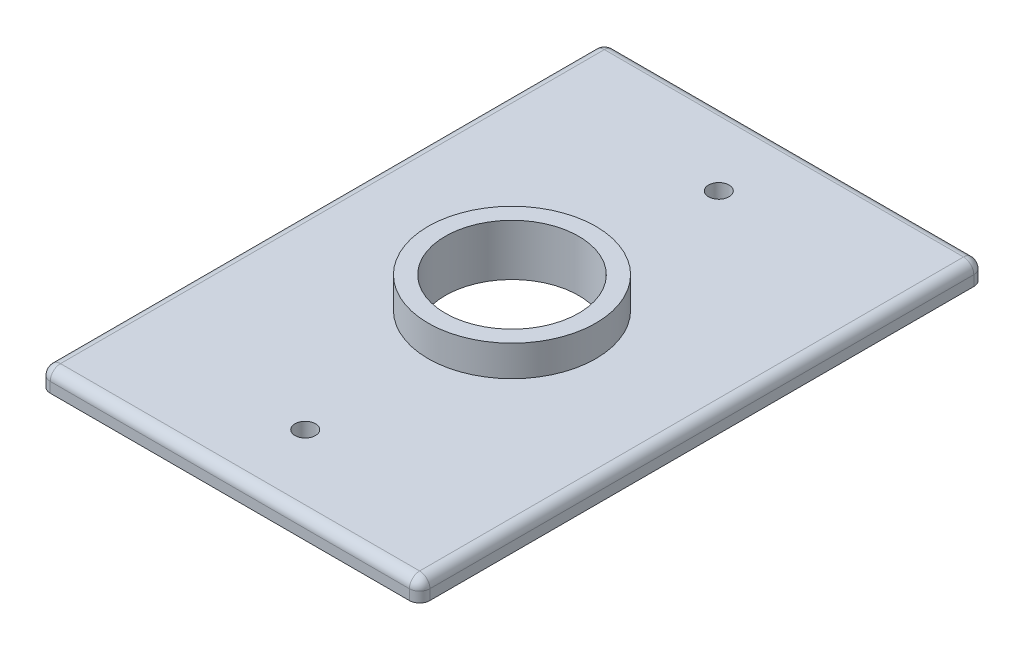
ISO-10303-21;
HEADER;
FILE_DESCRIPTION(('STEP AP214'),'2;1');
FILE_NAME('part.step','',(''),(''),'','','');
FILE_SCHEMA(('AUTOMOTIVE_DESIGN { 1 0 10303 214 1 1 1 1 }'));
ENDSEC;
DATA;
#1=APPLICATION_CONTEXT('core data for automotive mechanical design processes');
#2=APPLICATION_PROTOCOL_DEFINITION('international standard','automotive_design',2000,#1);
#3=PRODUCT_CONTEXT('',#1,'mechanical');
#4=PRODUCT('Part','Part','',(#3));
#5=PRODUCT_RELATED_PRODUCT_CATEGORY('part','',(#4));
#6=PRODUCT_DEFINITION_FORMATION('','',#4);
#7=PRODUCT_DEFINITION_CONTEXT('part definition',#1,'design');
#8=PRODUCT_DEFINITION('design','',#6,#7);
#9=PRODUCT_DEFINITION_SHAPE('','',#8);
#10=(LENGTH_UNIT() NAMED_UNIT(*) SI_UNIT(.MILLI.,.METRE.));
#11=(NAMED_UNIT(*) PLANE_ANGLE_UNIT() SI_UNIT($,.RADIAN.));
#12=(NAMED_UNIT(*) SI_UNIT($,.STERADIAN.) SOLID_ANGLE_UNIT());
#13=UNCERTAINTY_MEASURE_WITH_UNIT(LENGTH_MEASURE(1.E-05),#10,'distance_accuracy_value','');
#14=(GEOMETRIC_REPRESENTATION_CONTEXT(3) GLOBAL_UNCERTAINTY_ASSIGNED_CONTEXT((#13)) GLOBAL_UNIT_ASSIGNED_CONTEXT((#10,
#11,#12)) REPRESENTATION_CONTEXT('',''));
#15=CARTESIAN_POINT('',(0.,0.,0.));
#16=DIRECTION('',(0.,0.,1.));
#17=DIRECTION('',(1.,0.,0.));
#18=AXIS2_PLACEMENT_3D('',#15,#16,#17);
#19=CARTESIAN_POINT('',(0.,4.,0.));
#20=DIRECTION('',(0.,1.,0.));
#21=DIRECTION('',(0.,0.,1.));
#22=AXIS2_PLACEMENT_3D('',#19,#20,#21);
#23=PLANE('',#22);
#24=CARTESIAN_POINT('',(27.7075120139594,4.,3.72893254695976));
#25=DIRECTION('',(0.,1.,0.));
#26=DIRECTION('',(0.,0.,1.));
#27=AXIS2_PLACEMENT_3D('',#24,#25,#26);
#28=CIRCLE('',#27,2.);
#29=CARTESIAN_POINT('',(27.7075120139594,4.,5.72893254695976));
#30=VERTEX_POINT('',#29);
#31=EDGE_CURVE('E217',#30,#30,#28,.F.);
#32=ORIENTED_EDGE('',*,*,#31,.T.);
#33=EDGE_LOOP('',(#32));
#34=FACE_BOUND('',#33,.T.);
#35=DIRECTION('',(-1.,0.,0.));
#36=VECTOR('',#35,1.);
#37=CARTESIAN_POINT('',(-9.29248798604063,4.,-8.97106745304024));
#38=LINE('',#37,#36);
#39=CARTESIAN_POINT('',(62.7075120139594,4.,-8.97106745304024));
#40=VERTEX_POINT('',#39);
#41=CARTESIAN_POINT('',(-7.29248798604063,4.,-8.97106745304024));
#42=VERTEX_POINT('',#41);
#43=EDGE_CURVE('E175',#40,#42,#38,.T.);
#44=ORIENTED_EDGE('',*,*,#43,.T.);
#45=DIRECTION('',(0.,0.,1.));
#46=VECTOR('',#45,1.);
#47=CARTESIAN_POINT('',(-7.29248798604061,4.,97.0289325469598));
#48=LINE('',#47,#46);
#49=CARTESIAN_POINT('',(-7.29248798604061,4.,97.0289325469598));
#50=VERTEX_POINT('',#49);
#51=EDGE_CURVE('E11',#42,#50,#48,.T.);
#52=ORIENTED_EDGE('',*,*,#51,.T.);
#53=DIRECTION('',(1.,0.,0.));
#54=VECTOR('',#53,1.);
#55=CARTESIAN_POINT('',(64.7075120139594,4.,97.0289325469598));
#56=LINE('',#55,#54);
#57=CARTESIAN_POINT('',(62.7075120139594,4.,97.0289325469598));
#58=VERTEX_POINT('',#57);
#59=EDGE_CURVE('E142',#50,#58,#56,.T.);
#60=ORIENTED_EDGE('',*,*,#59,.T.);
#61=DIRECTION('',(0.,0.,-1.));
#62=VECTOR('',#61,1.);
#63=CARTESIAN_POINT('',(62.7075120139594,4.,-10.9710674530402));
#64=LINE('',#63,#62);
#65=EDGE_CURVE('E156',#58,#40,#64,.T.);
#66=ORIENTED_EDGE('',*,*,#65,.T.);
#67=EDGE_LOOP('',(#44,#52,#60,#66));
#68=FACE_BOUND('',#67,.T.);
#69=CARTESIAN_POINT('',(27.7075120139594,4.,84.3289325469597));
#70=DIRECTION('',(0.,1.,0.));
#71=DIRECTION('',(0.,0.,1.));
#72=AXIS2_PLACEMENT_3D('',#69,#70,#71);
#73=CIRCLE('',#72,2.);
#74=CARTESIAN_POINT('',(27.7075120139594,4.,86.3289325469597));
#75=VERTEX_POINT('',#74);
#76=EDGE_CURVE('E214',#75,#75,#73,.F.);
#77=ORIENTED_EDGE('',*,*,#76,.T.);
#78=EDGE_LOOP('',(#77));
#79=FACE_BOUND('',#78,.T.);
#80=CARTESIAN_POINT('',(27.7075120139594,4.,44.0289325469597));
#81=DIRECTION('',(0.,1.,0.));
#82=DIRECTION('',(0.,0.,1.));
#83=AXIS2_PLACEMENT_3D('',#80,#81,#82);
#84=CIRCLE('',#83,16.3436814833848);
#85=CARTESIAN_POINT('',(27.7075120139594,4.,60.3726140303445));
#86=VERTEX_POINT('',#85);
#87=EDGE_CURVE('E227',#86,#86,#84,.F.);
#88=ORIENTED_EDGE('',*,*,#87,.T.);
#89=EDGE_LOOP('',(#88));
#90=FACE_BOUND('',#89,.T.);
#91=ADVANCED_FACE('F35',(#34,#68,#79,#90),#23,.T.);
#92=CARTESIAN_POINT('',(0.,0.,0.));
#93=DIRECTION('',(0.,1.,0.));
#94=DIRECTION('',(0.,0.,1.));
#95=AXIS2_PLACEMENT_3D('',#92,#93,#94);
#96=PLANE('',#95);
#97=CARTESIAN_POINT('',(27.7075120139594,0.,44.0289325469597));
#98=DIRECTION('',(0.,1.,0.));
#99=DIRECTION('',(0.,0.,1.));
#100=AXIS2_PLACEMENT_3D('',#97,#98,#99);
#101=CIRCLE('',#100,13.);
#102=CARTESIAN_POINT('',(27.7075120139594,0.,57.0289325469597));
#103=VERTEX_POINT('',#102);
#104=EDGE_CURVE('E205',#103,#103,#101,.T.);
#105=ORIENTED_EDGE('',*,*,#104,.T.);
#106=EDGE_LOOP('',(#105));
#107=FACE_BOUND('',#106,.T.);
#108=CARTESIAN_POINT('',(27.7075120139594,0.,3.72893254695976));
#109=DIRECTION('',(0.,1.,0.));
#110=DIRECTION('',(0.,0.,1.));
#111=AXIS2_PLACEMENT_3D('',#108,#109,#110);
#112=CIRCLE('',#111,2.);
#113=CARTESIAN_POINT('',(27.7075120139594,0.,5.72893254695976));
#114=VERTEX_POINT('',#113);
#115=EDGE_CURVE('E39',#114,#114,#112,.F.);
#116=ORIENTED_EDGE('',*,*,#115,.F.);
#117=EDGE_LOOP('',(#116));
#118=FACE_BOUND('',#117,.T.);
#119=DIRECTION('',(0.,0.,1.));
#120=VECTOR('',#119,1.);
#121=CARTESIAN_POINT('',(-9.29248798604063,0.,-10.9710674530402));
#122=LINE('',#121,#120);
#123=CARTESIAN_POINT('',(-9.29248798604063,0.,-8.97106745304024));
#124=VERTEX_POINT('',#123);
#125=CARTESIAN_POINT('',(-9.29248798604061,0.,97.0289325469598));
#126=VERTEX_POINT('',#125);
#127=EDGE_CURVE('E144',#124,#126,#122,.T.);
#128=ORIENTED_EDGE('',*,*,#127,.F.);
#129=CARTESIAN_POINT('',(-7.29248798604063,0.,-8.97106745304024));
#130=DIRECTION('',(0.,1.,0.));
#131=DIRECTION('',(0.,0.,1.));
#132=AXIS2_PLACEMENT_3D('',#129,#130,#131);
#133=CIRCLE('',#132,2.);
#134=CARTESIAN_POINT('',(-7.29248798604063,0.,-10.9710674530402));
#135=VERTEX_POINT('',#134);
#136=EDGE_CURVE('E192',#124,#135,#133,.F.);
#137=ORIENTED_EDGE('',*,*,#136,.T.);
#138=DIRECTION('',(-1.,0.,0.));
#139=VECTOR('',#138,1.);
#140=CARTESIAN_POINT('',(-9.29248798604063,0.,-10.9710674530402));
#141=LINE('',#140,#139);
#142=CARTESIAN_POINT('',(62.7075120139594,0.,-10.9710674530402));
#143=VERTEX_POINT('',#142);
#144=EDGE_CURVE('E138',#143,#135,#141,.T.);
#145=ORIENTED_EDGE('',*,*,#144,.F.);
#146=CARTESIAN_POINT('',(62.7075120139594,0.,-8.97106745304024));
#147=DIRECTION('',(0.,1.,0.));
#148=DIRECTION('',(0.,0.,1.));
#149=AXIS2_PLACEMENT_3D('',#146,#147,#148);
#150=CIRCLE('',#149,2.);
#151=CARTESIAN_POINT('',(64.7075120139594,0.,-8.97106745304024));
#152=VERTEX_POINT('',#151);
#153=EDGE_CURVE('E137',#143,#152,#150,.F.);
#154=ORIENTED_EDGE('',*,*,#153,.T.);
#155=DIRECTION('',(0.,0.,-1.));
#156=VECTOR('',#155,1.);
#157=CARTESIAN_POINT('',(64.7075120139594,0.,-10.9710674530402));
#158=LINE('',#157,#156);
#159=CARTESIAN_POINT('',(64.7075120139594,0.,97.0289325469598));
#160=VERTEX_POINT('',#159);
#161=EDGE_CURVE('E127',#160,#152,#158,.T.);
#162=ORIENTED_EDGE('',*,*,#161,.F.);
#163=CARTESIAN_POINT('',(62.7075120139594,0.,97.0289325469598));
#164=DIRECTION('',(0.,1.,0.));
#165=DIRECTION('',(0.,0.,1.));
#166=AXIS2_PLACEMENT_3D('',#163,#164,#165);
#167=CIRCLE('',#166,2.);
#168=CARTESIAN_POINT('',(62.7075120139594,0.,99.0289325469598));
#169=VERTEX_POINT('',#168);
#170=EDGE_CURVE('E114',#160,#169,#167,.F.);
#171=ORIENTED_EDGE('',*,*,#170,.T.);
#172=DIRECTION('',(1.,0.,0.));
#173=VECTOR('',#172,1.);
#174=CARTESIAN_POINT('',(-9.29248798604061,0.,99.0289325469598));
#175=LINE('',#174,#173);
#176=CARTESIAN_POINT('',(-7.29248798604061,0.,99.0289325469598));
#177=VERTEX_POINT('',#176);
#178=EDGE_CURVE('E139',#177,#169,#175,.T.);
#179=ORIENTED_EDGE('',*,*,#178,.F.);
#180=CARTESIAN_POINT('',(-7.29248798604061,0.,97.0289325469598));
#181=DIRECTION('',(0.,1.,0.));
#182=DIRECTION('',(0.,0.,1.));
#183=AXIS2_PLACEMENT_3D('',#180,#181,#182);
#184=CIRCLE('',#183,2.);
#185=EDGE_CURVE('E190',#177,#126,#184,.F.);
#186=ORIENTED_EDGE('',*,*,#185,.T.);
#187=EDGE_LOOP('',(#128,#137,#145,#154,#162,#171,#179,#186));
#188=FACE_BOUND('',#187,.T.);
#189=CARTESIAN_POINT('',(27.7075120139594,0.,84.3289325469597));
#190=DIRECTION('',(0.,1.,0.));
#191=DIRECTION('',(0.,0.,1.));
#192=AXIS2_PLACEMENT_3D('',#189,#190,#191);
#193=CIRCLE('',#192,2.);
#194=CARTESIAN_POINT('',(27.7075120139594,0.,86.3289325469597));
#195=VERTEX_POINT('',#194);
#196=EDGE_CURVE('E215',#195,#195,#193,.F.);
#197=ORIENTED_EDGE('',*,*,#196,.F.);
#198=EDGE_LOOP('',(#197));
#199=FACE_BOUND('',#198,.T.);
#200=ADVANCED_FACE('F134',(#107,#118,#188,#199),#96,.F.);
#201=CARTESIAN_POINT('',(-9.29248798604063,4.,-10.9710674530402));
#202=DIRECTION('',(1.,0.,0.));
#203=DIRECTION('',(0.,0.,-1.));
#204=AXIS2_PLACEMENT_3D('',#201,#202,#203);
#205=PLANE('',#204);
#206=DIRECTION('',(0.,0.,1.));
#207=VECTOR('',#206,1.);
#208=CARTESIAN_POINT('',(-9.29248798604063,2.,-8.97106745304024));
#209=LINE('',#208,#207);
#210=CARTESIAN_POINT('',(-9.29248798604061,2.,97.0289325469598));
#211=VERTEX_POINT('',#210);
#212=CARTESIAN_POINT('',(-9.29248798604063,2.,-8.97106745304024));
#213=VERTEX_POINT('',#212);
#214=EDGE_CURVE('E177',#211,#213,#209,.F.);
#215=ORIENTED_EDGE('',*,*,#214,.T.);
#216=DIRECTION('',(0.,-1.,0.));
#217=VECTOR('',#216,1.);
#218=CARTESIAN_POINT('',(-9.29248798604063,4.,-8.97106745304024));
#219=LINE('',#218,#217);
#220=EDGE_CURVE('E187',#213,#124,#219,.T.);
#221=ORIENTED_EDGE('',*,*,#220,.T.);
#222=ORIENTED_EDGE('',*,*,#127,.T.);
#223=DIRECTION('',(0.,-1.,0.));
#224=VECTOR('',#223,1.);
#225=CARTESIAN_POINT('',(-9.29248798604061,4.,97.0289325469598));
#226=LINE('',#225,#224);
#227=EDGE_CURVE('E185',#126,#211,#226,.F.);
#228=ORIENTED_EDGE('',*,*,#227,.T.);
#229=EDGE_LOOP('',(#215,#221,#222,#228));
#230=FACE_BOUND('',#229,.T.);
#231=ADVANCED_FACE('F233',(#230),#205,.F.);
#232=CARTESIAN_POINT('',(-9.29248798604061,4.,99.0289325469598));
#233=DIRECTION('',(0.,0.,-1.));
#234=DIRECTION('',(-1.,0.,0.));
#235=AXIS2_PLACEMENT_3D('',#232,#233,#234);
#236=PLANE('',#235);
#237=DIRECTION('',(1.,0.,0.));
#238=VECTOR('',#237,1.);
#239=CARTESIAN_POINT('',(-9.29248798604061,2.,99.0289325469598));
#240=LINE('',#239,#238);
#241=CARTESIAN_POINT('',(62.7075120139594,2.,99.0289325469598));
#242=VERTEX_POINT('',#241);
#243=CARTESIAN_POINT('',(-7.29248798604061,2.,99.0289325469598));
#244=VERTEX_POINT('',#243);
#245=EDGE_CURVE('E149',#242,#244,#240,.F.);
#246=ORIENTED_EDGE('',*,*,#245,.T.);
#247=DIRECTION('',(0.,-1.,0.));
#248=VECTOR('',#247,1.);
#249=CARTESIAN_POINT('',(-7.29248798604061,4.,99.0289325469598));
#250=LINE('',#249,#248);
#251=EDGE_CURVE('E198',#244,#177,#250,.T.);
#252=ORIENTED_EDGE('',*,*,#251,.T.);
#253=ORIENTED_EDGE('',*,*,#178,.T.);
#254=DIRECTION('',(0.,-1.,0.));
#255=VECTOR('',#254,1.);
#256=CARTESIAN_POINT('',(62.7075120139594,4.,99.0289325469598));
#257=LINE('',#256,#255);
#258=EDGE_CURVE('E119',#169,#242,#257,.F.);
#259=ORIENTED_EDGE('',*,*,#258,.T.);
#260=EDGE_LOOP('',(#246,#252,#253,#259));
#261=FACE_BOUND('',#260,.T.);
#262=ADVANCED_FACE('F277',(#261),#236,.F.);
#263=CARTESIAN_POINT('',(64.7075120139594,4.,-10.9710674530402));
#264=DIRECTION('',(-1.,0.,0.));
#265=DIRECTION('',(0.,0.,1.));
#266=AXIS2_PLACEMENT_3D('',#263,#264,#265);
#267=PLANE('',#266);
#268=ORIENTED_EDGE('',*,*,#161,.T.);
#269=DIRECTION('',(0.,-1.,0.));
#270=VECTOR('',#269,1.);
#271=CARTESIAN_POINT('',(64.7075120139594,4.,-8.97106745304024));
#272=LINE('',#271,#270);
#273=CARTESIAN_POINT('',(64.7075120139594,2.,-8.97106745304024));
#274=VERTEX_POINT('',#273);
#275=EDGE_CURVE('E171',#152,#274,#272,.F.);
#276=ORIENTED_EDGE('',*,*,#275,.T.);
#277=DIRECTION('',(0.,0.,-1.));
#278=VECTOR('',#277,1.);
#279=CARTESIAN_POINT('',(64.7075120139594,2.,97.0289325469598));
#280=LINE('',#279,#278);
#281=CARTESIAN_POINT('',(64.7075120139594,2.,97.0289325469598));
#282=VERTEX_POINT('',#281);
#283=EDGE_CURVE('E130',#274,#282,#280,.F.);
#284=ORIENTED_EDGE('',*,*,#283,.T.);
#285=DIRECTION('',(0.,-1.,0.));
#286=VECTOR('',#285,1.);
#287=CARTESIAN_POINT('',(64.7075120139594,4.,97.0289325469598));
#288=LINE('',#287,#286);
#289=EDGE_CURVE('E118',#282,#160,#288,.T.);
#290=ORIENTED_EDGE('',*,*,#289,.T.);
#291=EDGE_LOOP('',(#268,#276,#284,#290));
#292=FACE_BOUND('',#291,.T.);
#293=ADVANCED_FACE('F126',(#292),#267,.F.);
#294=CARTESIAN_POINT('',(-9.29248798604063,4.,-10.9710674530402));
#295=DIRECTION('',(0.,0.,1.));
#296=DIRECTION('',(1.,0.,0.));
#297=AXIS2_PLACEMENT_3D('',#294,#295,#296);
#298=PLANE('',#297);
#299=ORIENTED_EDGE('',*,*,#144,.T.);
#300=DIRECTION('',(0.,-1.,0.));
#301=VECTOR('',#300,1.);
#302=CARTESIAN_POINT('',(-7.29248798604063,4.,-10.9710674530402));
#303=LINE('',#302,#301);
#304=CARTESIAN_POINT('',(-7.29248798604062,2.,-10.9710674530402));
#305=VERTEX_POINT('',#304);
#306=EDGE_CURVE('E194',#135,#305,#303,.F.);
#307=ORIENTED_EDGE('',*,*,#306,.T.);
#308=DIRECTION('',(-1.,0.,0.));
#309=VECTOR('',#308,1.);
#310=CARTESIAN_POINT('',(62.7075120139594,2.,-10.9710674530402));
#311=LINE('',#310,#309);
#312=CARTESIAN_POINT('',(62.7075120139594,2.,-10.9710674530402));
#313=VERTEX_POINT('',#312);
#314=EDGE_CURVE('E159',#305,#313,#311,.F.);
#315=ORIENTED_EDGE('',*,*,#314,.T.);
#316=DIRECTION('',(0.,-1.,0.));
#317=VECTOR('',#316,1.);
#318=CARTESIAN_POINT('',(62.7075120139594,4.,-10.9710674530402));
#319=LINE('',#318,#317);
#320=EDGE_CURVE('E167',#313,#143,#319,.T.);
#321=ORIENTED_EDGE('',*,*,#320,.T.);
#322=EDGE_LOOP('',(#299,#307,#315,#321));
#323=FACE_BOUND('',#322,.T.);
#324=ADVANCED_FACE('F254',(#323),#298,.F.);
#325=CARTESIAN_POINT('',(0.,2.,97.0289325469598));
#326=DIRECTION('',(-1.,0.,0.));
#327=DIRECTION('',(0.,0.,1.));
#328=AXIS2_PLACEMENT_3D('',#325,#326,#327);
#329=CYLINDRICAL_SURFACE('',#328,2.);
#330=ORIENTED_EDGE('',*,*,#59,.F.);
#331=CARTESIAN_POINT('',(-7.29248798604061,2.,97.0289325469598));
#332=DIRECTION('',(-1.,0.,0.));
#333=DIRECTION('',(0.,0.,1.));
#334=AXIS2_PLACEMENT_3D('',#331,#332,#333);
#335=CIRCLE('',#334,2.);
#336=EDGE_CURVE('E44',#50,#244,#335,.F.);
#337=ORIENTED_EDGE('',*,*,#336,.T.);
#338=ORIENTED_EDGE('',*,*,#245,.F.);
#339=CARTESIAN_POINT('',(62.7075120139594,2.,97.0289325469598));
#340=DIRECTION('',(-1.,0.,0.));
#341=DIRECTION('',(0.,0.,1.));
#342=AXIS2_PLACEMENT_3D('',#339,#340,#341);
#343=CIRCLE('',#342,2.);
#344=EDGE_CURVE('E153',#242,#58,#343,.T.);
#345=ORIENTED_EDGE('',*,*,#344,.T.);
#346=EDGE_LOOP('',(#330,#337,#338,#345));
#347=FACE_BOUND('',#346,.T.);
#348=ADVANCED_FACE('F275',(#347),#329,.T.);
#349=CARTESIAN_POINT('',(62.7075120139594,2.,0.));
#350=DIRECTION('',(0.,0.,1.));
#351=DIRECTION('',(1.,0.,0.));
#352=AXIS2_PLACEMENT_3D('',#349,#350,#351);
#353=CYLINDRICAL_SURFACE('',#352,2.);
#354=ORIENTED_EDGE('',*,*,#283,.F.);
#355=CARTESIAN_POINT('',(62.7075120139594,2.,-8.97106745304024));
#356=DIRECTION('',(0.,0.,1.));
#357=DIRECTION('',(1.,0.,0.));
#358=AXIS2_PLACEMENT_3D('',#355,#356,#357);
#359=CIRCLE('',#358,2.);
#360=EDGE_CURVE('E173',#274,#40,#359,.T.);
#361=ORIENTED_EDGE('',*,*,#360,.T.);
#362=ORIENTED_EDGE('',*,*,#65,.F.);
#363=CARTESIAN_POINT('',(62.7075120139594,2.,97.0289325469598));
#364=DIRECTION('',(0.,0.,1.));
#365=DIRECTION('',(1.,0.,0.));
#366=AXIS2_PLACEMENT_3D('',#363,#364,#365);
#367=CIRCLE('',#366,2.);
#368=EDGE_CURVE('E162',#282,#58,#367,.T.);
#369=ORIENTED_EDGE('',*,*,#368,.F.);
#370=EDGE_LOOP('',(#354,#361,#362,#369));
#371=FACE_BOUND('',#370,.T.);
#372=ADVANCED_FACE('F263',(#371),#353,.T.);
#373=CARTESIAN_POINT('',(62.7075120139594,2.,97.0289325469598));
#374=DIRECTION('',(0.,0.,1.));
#375=DIRECTION('',(1.,0.,0.));
#376=AXIS2_PLACEMENT_3D('',#373,#374,#375);
#377=SPHERICAL_SURFACE('',#376,2.);
#378=ORIENTED_EDGE('',*,*,#368,.T.);
#379=ORIENTED_EDGE('',*,*,#344,.F.);
#380=CARTESIAN_POINT('',(62.7075120139594,2.,97.0289325469598));
#381=DIRECTION('',(0.,-1.,0.));
#382=DIRECTION('',(0.,0.,-1.));
#383=AXIS2_PLACEMENT_3D('',#380,#381,#382);
#384=CIRCLE('',#383,2.);
#385=EDGE_CURVE('E160',#282,#242,#384,.T.);
#386=ORIENTED_EDGE('',*,*,#385,.F.);
#387=EDGE_LOOP('',(#378,#379,#386));
#388=FACE_BOUND('',#387,.T.);
#389=ADVANCED_FACE('F274',(#388),#377,.T.);
#390=CARTESIAN_POINT('',(62.7075120139594,4.,97.0289325469598));
#391=DIRECTION('',(0.,-1.,0.));
#392=DIRECTION('',(0.,0.,-1.));
#393=AXIS2_PLACEMENT_3D('',#390,#391,#392);
#394=CYLINDRICAL_SURFACE('',#393,2.);
#395=ORIENTED_EDGE('',*,*,#385,.T.);
#396=ORIENTED_EDGE('',*,*,#258,.F.);
#397=ORIENTED_EDGE('',*,*,#170,.F.);
#398=ORIENTED_EDGE('',*,*,#289,.F.);
#399=EDGE_LOOP('',(#395,#396,#397,#398));
#400=FACE_BOUND('',#399,.T.);
#401=ADVANCED_FACE('F117',(#400),#394,.T.);
#402=CARTESIAN_POINT('',(0.,2.,-8.97106745304024));
#403=DIRECTION('',(1.,0.,0.));
#404=DIRECTION('',(0.,0.,-1.));
#405=AXIS2_PLACEMENT_3D('',#402,#403,#404);
#406=CYLINDRICAL_SURFACE('',#405,2.);
#407=ORIENTED_EDGE('',*,*,#314,.F.);
#408=CARTESIAN_POINT('',(-7.29248798604063,2.,-8.97106745304024));
#409=DIRECTION('',(1.,0.,0.));
#410=DIRECTION('',(0.,0.,-1.));
#411=AXIS2_PLACEMENT_3D('',#408,#409,#410);
#412=CIRCLE('',#411,2.);
#413=EDGE_CURVE('E196',#305,#42,#412,.T.);
#414=ORIENTED_EDGE('',*,*,#413,.T.);
#415=ORIENTED_EDGE('',*,*,#43,.F.);
#416=CARTESIAN_POINT('',(62.7075120139594,2.,-8.97106745304024));
#417=DIRECTION('',(1.,0.,0.));
#418=DIRECTION('',(0.,0.,-1.));
#419=AXIS2_PLACEMENT_3D('',#416,#417,#418);
#420=CIRCLE('',#419,2.);
#421=EDGE_CURVE('E163',#313,#40,#420,.T.);
#422=ORIENTED_EDGE('',*,*,#421,.F.);
#423=EDGE_LOOP('',(#407,#414,#415,#422));
#424=FACE_BOUND('',#423,.T.);
#425=ADVANCED_FACE('F270',(#424),#406,.T.);
#426=CARTESIAN_POINT('',(62.7075120139594,2.,-8.97106745304024));
#427=DIRECTION('',(0.,0.,1.));
#428=DIRECTION('',(1.,0.,0.));
#429=AXIS2_PLACEMENT_3D('',#426,#427,#428);
#430=SPHERICAL_SURFACE('',#429,2.);
#431=ORIENTED_EDGE('',*,*,#421,.T.);
#432=ORIENTED_EDGE('',*,*,#360,.F.);
#433=CARTESIAN_POINT('',(62.7075120139594,2.,-8.97106745304024));
#434=DIRECTION('',(0.,-1.,0.));
#435=DIRECTION('',(0.,0.,-1.));
#436=AXIS2_PLACEMENT_3D('',#433,#434,#435);
#437=CIRCLE('',#436,2.);
#438=EDGE_CURVE('E178',#313,#274,#437,.T.);
#439=ORIENTED_EDGE('',*,*,#438,.F.);
#440=EDGE_LOOP('',(#431,#432,#439));
#441=FACE_BOUND('',#440,.T.);
#442=ADVANCED_FACE('F267',(#441),#430,.T.);
#443=CARTESIAN_POINT('',(62.7075120139594,4.,-8.97106745304024));
#444=DIRECTION('',(0.,-1.,0.));
#445=DIRECTION('',(0.,0.,-1.));
#446=AXIS2_PLACEMENT_3D('',#443,#444,#445);
#447=CYLINDRICAL_SURFACE('',#446,2.);
#448=ORIENTED_EDGE('',*,*,#438,.T.);
#449=ORIENTED_EDGE('',*,*,#275,.F.);
#450=ORIENTED_EDGE('',*,*,#153,.F.);
#451=ORIENTED_EDGE('',*,*,#320,.F.);
#452=EDGE_LOOP('',(#448,#449,#450,#451));
#453=FACE_BOUND('',#452,.T.);
#454=ADVANCED_FACE('F259',(#453),#447,.T.);
#455=CARTESIAN_POINT('',(-7.29248798604061,4.,97.0289325469598));
#456=DIRECTION('',(0.,-1.,0.));
#457=DIRECTION('',(0.,0.,-1.));
#458=AXIS2_PLACEMENT_3D('',#455,#456,#457);
#459=CYLINDRICAL_SURFACE('',#458,2.);
#460=ORIENTED_EDGE('',*,*,#185,.F.);
#461=ORIENTED_EDGE('',*,*,#251,.F.);
#462=CARTESIAN_POINT('',(-7.29248798604061,2.,97.0289325469598));
#463=DIRECTION('',(0.,1.,0.));
#464=DIRECTION('',(0.,0.,1.));
#465=AXIS2_PLACEMENT_3D('',#462,#463,#464);
#466=CIRCLE('',#465,2.);
#467=EDGE_CURVE('E181',#211,#244,#466,.T.);
#468=ORIENTED_EDGE('',*,*,#467,.F.);
#469=ORIENTED_EDGE('',*,*,#227,.F.);
#470=EDGE_LOOP('',(#460,#461,#468,#469));
#471=FACE_BOUND('',#470,.T.);
#472=ADVANCED_FACE('F37',(#471),#459,.T.);
#473=CARTESIAN_POINT('',(-7.29248798604061,2.,97.0289325469598));
#474=DIRECTION('',(0.,0.,1.));
#475=DIRECTION('',(1.,0.,0.));
#476=AXIS2_PLACEMENT_3D('',#473,#474,#475);
#477=SPHERICAL_SURFACE('',#476,2.);
#478=ORIENTED_EDGE('',*,*,#467,.T.);
#479=ORIENTED_EDGE('',*,*,#336,.F.);
#480=CARTESIAN_POINT('',(-7.29248798604061,2.,97.0289325469598));
#481=DIRECTION('',(0.,0.,-1.));
#482=DIRECTION('',(-1.,0.,0.));
#483=AXIS2_PLACEMENT_3D('',#480,#481,#482);
#484=CIRCLE('',#483,2.);
#485=EDGE_CURVE('E208',#211,#50,#484,.T.);
#486=ORIENTED_EDGE('',*,*,#485,.F.);
#487=EDGE_LOOP('',(#478,#479,#486));
#488=FACE_BOUND('',#487,.T.);
#489=ADVANCED_FACE('F242',(#488),#477,.T.);
#490=CARTESIAN_POINT('',(-7.29248798604062,2.,0.));
#491=DIRECTION('',(0.,0.,-1.));
#492=DIRECTION('',(-1.,0.,0.));
#493=AXIS2_PLACEMENT_3D('',#490,#491,#492);
#494=CYLINDRICAL_SURFACE('',#493,2.);
#495=ORIENTED_EDGE('',*,*,#485,.T.);
#496=ORIENTED_EDGE('',*,*,#51,.F.);
#497=CARTESIAN_POINT('',(-7.29248798604063,2.,-8.97106745304024));
#498=DIRECTION('',(0.,0.,-1.));
#499=DIRECTION('',(-1.,0.,0.));
#500=AXIS2_PLACEMENT_3D('',#497,#498,#499);
#501=CIRCLE('',#500,2.);
#502=EDGE_CURVE('E204',#213,#42,#501,.T.);
#503=ORIENTED_EDGE('',*,*,#502,.F.);
#504=ORIENTED_EDGE('',*,*,#214,.F.);
#505=EDGE_LOOP('',(#495,#496,#503,#504));
#506=FACE_BOUND('',#505,.T.);
#507=ADVANCED_FACE('F245',(#506),#494,.T.);
#508=CARTESIAN_POINT('',(-7.29248798604063,2.,-8.97106745304024));
#509=DIRECTION('',(0.,0.,1.));
#510=DIRECTION('',(1.,0.,0.));
#511=AXIS2_PLACEMENT_3D('',#508,#509,#510);
#512=SPHERICAL_SURFACE('',#511,2.);
#513=ORIENTED_EDGE('',*,*,#502,.T.);
#514=ORIENTED_EDGE('',*,*,#413,.F.);
#515=CARTESIAN_POINT('',(-7.29248798604063,2.,-8.97106745304024));
#516=DIRECTION('',(0.,-1.,0.));
#517=DIRECTION('',(0.,0.,-1.));
#518=AXIS2_PLACEMENT_3D('',#515,#516,#517);
#519=CIRCLE('',#518,2.);
#520=EDGE_CURVE('E201',#213,#305,#519,.T.);
#521=ORIENTED_EDGE('',*,*,#520,.F.);
#522=EDGE_LOOP('',(#513,#514,#521));
#523=FACE_BOUND('',#522,.T.);
#524=ADVANCED_FACE('F249',(#523),#512,.T.);
#525=CARTESIAN_POINT('',(-7.29248798604063,4.,-8.97106745304024));
#526=DIRECTION('',(0.,-1.,0.));
#527=DIRECTION('',(0.,0.,-1.));
#528=AXIS2_PLACEMENT_3D('',#525,#526,#527);
#529=CYLINDRICAL_SURFACE('',#528,2.);
#530=ORIENTED_EDGE('',*,*,#520,.T.);
#531=ORIENTED_EDGE('',*,*,#306,.F.);
#532=ORIENTED_EDGE('',*,*,#136,.F.);
#533=ORIENTED_EDGE('',*,*,#220,.F.);
#534=EDGE_LOOP('',(#530,#531,#532,#533));
#535=FACE_BOUND('',#534,.T.);
#536=ADVANCED_FACE('F252',(#535),#529,.T.);
#537=CARTESIAN_POINT('',(27.7075120139594,-10.,44.0289325469597));
#538=DIRECTION('',(0.,1.,0.));
#539=DIRECTION('',(0.,0.,1.));
#540=AXIS2_PLACEMENT_3D('',#537,#538,#539);
#541=CYLINDRICAL_SURFACE('',#540,13.);
#542=ORIENTED_EDGE('',*,*,#104,.F.);
#543=EDGE_LOOP('',(#542));
#544=FACE_BOUND('',#543,.T.);
#545=CARTESIAN_POINT('',(27.7075120139594,10.,44.0289325469597));
#546=DIRECTION('',(0.,1.,0.));
#547=DIRECTION('',(0.,0.,1.));
#548=AXIS2_PLACEMENT_3D('',#545,#546,#547);
#549=CIRCLE('',#548,13.);
#550=CARTESIAN_POINT('',(27.7075120139594,10.,57.0289325469597));
#551=VERTEX_POINT('',#550);
#552=EDGE_CURVE('E435',#551,#551,#549,.T.);
#553=ORIENTED_EDGE('',*,*,#552,.T.);
#554=EDGE_LOOP('',(#553));
#555=FACE_BOUND('',#554,.T.);
#556=ADVANCED_FACE('F294',(#544,#555),#541,.F.);
#557=CARTESIAN_POINT('',(27.7075120139594,15.,84.3289325469597));
#558=DIRECTION('',(0.,-1.,0.));
#559=DIRECTION('',(0.,0.,-1.));
#560=AXIS2_PLACEMENT_3D('',#557,#558,#559);
#561=CYLINDRICAL_SURFACE('',#560,2.);
#562=ORIENTED_EDGE('',*,*,#76,.F.);
#563=EDGE_LOOP('',(#562));
#564=FACE_BOUND('',#563,.T.);
#565=ORIENTED_EDGE('',*,*,#196,.T.);
#566=EDGE_LOOP('',(#565));
#567=FACE_BOUND('',#566,.T.);
#568=ADVANCED_FACE('F396',(#564,#567),#561,.F.);
#569=CARTESIAN_POINT('',(27.7075120139594,15.,3.72893254695976));
#570=DIRECTION('',(0.,-1.,0.));
#571=DIRECTION('',(0.,0.,-1.));
#572=AXIS2_PLACEMENT_3D('',#569,#570,#571);
#573=CYLINDRICAL_SURFACE('',#572,2.);
#574=ORIENTED_EDGE('',*,*,#31,.F.);
#575=EDGE_LOOP('',(#574));
#576=FACE_BOUND('',#575,.T.);
#577=ORIENTED_EDGE('',*,*,#115,.T.);
#578=EDGE_LOOP('',(#577));
#579=FACE_BOUND('',#578,.T.);
#580=ADVANCED_FACE('F408',(#576,#579),#573,.F.);
#581=CARTESIAN_POINT('',(27.7075120139594,10.,44.0289325469597));
#582=DIRECTION('',(0.,1.,0.));
#583=DIRECTION('',(0.,0.,1.));
#584=AXIS2_PLACEMENT_3D('',#581,#582,#583);
#585=PLANE('',#584);
#586=CARTESIAN_POINT('',(27.7075120139594,10.,44.0289325469597));
#587=DIRECTION('',(0.,1.,0.));
#588=DIRECTION('',(0.,0.,1.));
#589=AXIS2_PLACEMENT_3D('',#586,#587,#588);
#590=CIRCLE('',#589,16.3436814833848);
#591=CARTESIAN_POINT('',(27.7075120139594,10.,60.3726140303445));
#592=VERTEX_POINT('',#591);
#593=EDGE_CURVE('E433',#592,#592,#590,.T.);
#594=ORIENTED_EDGE('',*,*,#593,.T.);
#595=EDGE_LOOP('',(#594));
#596=FACE_BOUND('',#595,.T.);
#597=ORIENTED_EDGE('',*,*,#552,.F.);
#598=EDGE_LOOP('',(#597));
#599=FACE_BOUND('',#598,.T.);
#600=ADVANCED_FACE('F403',(#596,#599),#585,.T.);
#601=CARTESIAN_POINT('',(27.7075120139594,10.,44.0289325469597));
#602=DIRECTION('',(0.,-1.,0.));
#603=DIRECTION('',(0.,0.,-1.));
#604=AXIS2_PLACEMENT_3D('',#601,#602,#603);
#605=CYLINDRICAL_SURFACE('',#604,16.3436814833848);
#606=ORIENTED_EDGE('',*,*,#87,.F.);
#607=EDGE_LOOP('',(#606));
#608=FACE_BOUND('',#607,.T.);
#609=ORIENTED_EDGE('',*,*,#593,.F.);
#610=EDGE_LOOP('',(#609));
#611=FACE_BOUND('',#610,.T.);
#612=ADVANCED_FACE('F407',(#608,#611),#605,.T.);
#613=CLOSED_SHELL('',(#91,#200,#231,#262,#293,#324,#348,#372,#389,#401,#425,#442,#454,#472,#489,
#507,#524,#536,#556,#568,#580,#600,#612));
#614=MANIFOLD_SOLID_BREP('B2',#613);
#615=ADVANCED_BREP_SHAPE_REPRESENTATION('',(#18,#614),#14);
#616=SHAPE_DEFINITION_REPRESENTATION(#9,#615);
ENDSEC;
END-ISO-10303-21;
